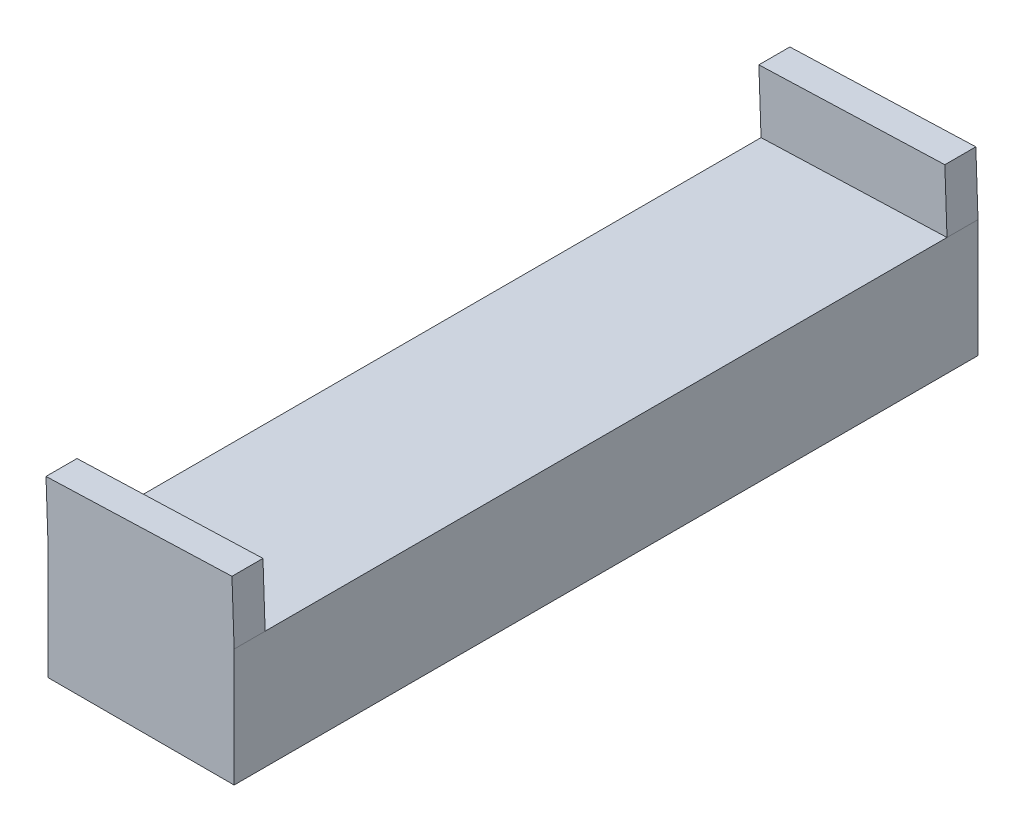
ISO-10303-21;
HEADER;
FILE_DESCRIPTION(('STEP AP214'),'2;1');
FILE_NAME('part.step','',(''),(''),'','','');
FILE_SCHEMA(('AUTOMOTIVE_DESIGN { 1 0 10303 214 1 1 1 1 }'));
ENDSEC;
DATA;
#1=APPLICATION_CONTEXT('core data for automotive mechanical design processes');
#2=APPLICATION_PROTOCOL_DEFINITION('international standard','automotive_design',2000,#1);
#3=PRODUCT_CONTEXT('',#1,'mechanical');
#4=PRODUCT('Part','Part','',(#3));
#5=PRODUCT_RELATED_PRODUCT_CATEGORY('part','',(#4));
#6=PRODUCT_DEFINITION_FORMATION('','',#4);
#7=PRODUCT_DEFINITION_CONTEXT('part definition',#1,'design');
#8=PRODUCT_DEFINITION('design','',#6,#7);
#9=PRODUCT_DEFINITION_SHAPE('','',#8);
#10=(LENGTH_UNIT() NAMED_UNIT(*) SI_UNIT(.MILLI.,.METRE.));
#11=(NAMED_UNIT(*) PLANE_ANGLE_UNIT() SI_UNIT($,.RADIAN.));
#12=(NAMED_UNIT(*) SI_UNIT($,.STERADIAN.) SOLID_ANGLE_UNIT());
#13=UNCERTAINTY_MEASURE_WITH_UNIT(LENGTH_MEASURE(1.E-05),#10,'distance_accuracy_value','');
#14=(GEOMETRIC_REPRESENTATION_CONTEXT(3) GLOBAL_UNCERTAINTY_ASSIGNED_CONTEXT((#13)) GLOBAL_UNIT_ASSIGNED_CONTEXT((#10,
#11,#12)) REPRESENTATION_CONTEXT('',''));
#15=CARTESIAN_POINT('',(0.,0.,0.));
#16=DIRECTION('',(0.,0.,1.));
#17=DIRECTION('',(1.,0.,0.));
#18=AXIS2_PLACEMENT_3D('',#15,#16,#17);
#19=CARTESIAN_POINT('',(738.734501426572,19.,-6544.76084793364));
#20=DIRECTION('',(0.034899496702494,-0.999390827019096,0.));
#21=DIRECTION('',(0.999390827019096,0.034899496702494,0.));
#22=AXIS2_PLACEMENT_3D('',#19,#20,#21);
#23=PLANE('',#22);
#24=DIRECTION('',(-0.999390827019096,-0.034899496702494,0.));
#25=VECTOR('',#24,1.);
#26=CARTESIAN_POINT('',(738.734501426572,19.,-6429.76084793364));
#27=LINE('',#26,#25);
#28=CARTESIAN_POINT('',(738.734501426572,19.,-6429.76084793364));
#29=VERTEX_POINT('',#28);
#30=CARTESIAN_POINT('',(708.734501426572,17.9523769152478,-6429.76084793364));
#31=VERTEX_POINT('',#30);
#32=EDGE_CURVE('E212',#29,#31,#27,.T.);
#33=ORIENTED_EDGE('',*,*,#32,.F.);
#34=DIRECTION('',(0.,0.,-1.));
#35=VECTOR('',#34,1.);
#36=CARTESIAN_POINT('',(738.734501426572,19.,-6544.76084793364));
#37=LINE('',#36,#35);
#38=CARTESIAN_POINT('',(738.734501426572,19.,-6539.76084793364));
#39=VERTEX_POINT('',#38);
#40=EDGE_CURVE('E171',#29,#39,#37,.T.);
#41=ORIENTED_EDGE('',*,*,#40,.T.);
#42=DIRECTION('',(0.999390827019096,0.034899496702494,0.));
#43=VECTOR('',#42,1.);
#44=CARTESIAN_POINT('',(708.734501426572,17.9523769152478,-6539.76084793364));
#45=LINE('',#44,#43);
#46=CARTESIAN_POINT('',(708.734501426572,17.9523769152478,-6539.76084793364));
#47=VERTEX_POINT('',#46);
#48=EDGE_CURVE('E55',#47,#39,#45,.T.);
#49=ORIENTED_EDGE('',*,*,#48,.F.);
#50=DIRECTION('',(0.,0.,1.));
#51=VECTOR('',#50,1.);
#52=CARTESIAN_POINT('',(708.734501426572,17.9523769152478,-6544.76084793364));
#53=LINE('',#52,#51);
#54=EDGE_CURVE('E164',#47,#31,#53,.T.);
#55=ORIENTED_EDGE('',*,*,#54,.T.);
#56=EDGE_LOOP('',(#33,#41,#49,#55));
#57=FACE_BOUND('',#56,.T.);
#58=ADVANCED_FACE('F33',(#57),#23,.F.);
#59=CARTESIAN_POINT('',(708.734501426572,19.,-6544.76084793364));
#60=DIRECTION('',(1.,0.,0.));
#61=DIRECTION('',(0.,0.,-1.));
#62=AXIS2_PLACEMENT_3D('',#59,#60,#61);
#63=PLANE('',#62);
#64=DIRECTION('',(0.,-1.,0.));
#65=VECTOR('',#64,1.);
#66=CARTESIAN_POINT('',(708.734501426572,19.,-6424.76084793364));
#67=LINE('',#66,#65);
#68=CARTESIAN_POINT('',(708.734501426572,17.9523769152478,-6424.76084793364));
#69=VERTEX_POINT('',#68);
#70=CARTESIAN_POINT('',(708.734501426572,0.,-6424.76084793364));
#71=VERTEX_POINT('',#70);
#72=EDGE_CURVE('E11',#69,#71,#67,.T.);
#73=ORIENTED_EDGE('',*,*,#72,.F.);
#74=DIRECTION('',(0.,0.,1.));
#75=VECTOR('',#74,1.);
#76=CARTESIAN_POINT('',(708.734501426572,17.9523769152478,-6424.76084793364));
#77=LINE('',#76,#75);
#78=EDGE_CURVE('E48',#31,#69,#77,.T.);
#79=ORIENTED_EDGE('',*,*,#78,.F.);
#80=ORIENTED_EDGE('',*,*,#54,.F.);
#81=CARTESIAN_POINT('',(708.734501426572,17.9523769152478,-6544.76084793364));
#82=VERTEX_POINT('',#81);
#83=EDGE_CURVE('E165',#82,#47,#53,.T.);
#84=ORIENTED_EDGE('',*,*,#83,.F.);
#85=DIRECTION('',(0.,-1.,0.));
#86=VECTOR('',#85,1.);
#87=CARTESIAN_POINT('',(708.734501426572,19.,-6544.76084793364));
#88=LINE('',#87,#86);
#89=CARTESIAN_POINT('',(708.734501426572,0.,-6544.76084793364));
#90=VERTEX_POINT('',#89);
#91=EDGE_CURVE('E170',#82,#90,#88,.T.);
#92=ORIENTED_EDGE('',*,*,#91,.T.);
#93=DIRECTION('',(0.,0.,1.));
#94=VECTOR('',#93,1.);
#95=CARTESIAN_POINT('',(708.734501426572,0.,-6544.76084793364));
#96=LINE('',#95,#94);
#97=EDGE_CURVE('E168',#90,#71,#96,.T.);
#98=ORIENTED_EDGE('',*,*,#97,.T.);
#99=EDGE_LOOP('',(#73,#79,#80,#84,#92,#98));
#100=FACE_BOUND('',#99,.T.);
#101=ADVANCED_FACE('F35',(#100),#63,.F.);
#102=CARTESIAN_POINT('',(708.734501426572,19.,-6424.76084793364));
#103=DIRECTION('',(0.,0.,-1.));
#104=DIRECTION('',(-1.,0.,0.));
#105=AXIS2_PLACEMENT_3D('',#102,#103,#104);
#106=PLANE('',#105);
#107=DIRECTION('',(0.,-1.,0.));
#108=VECTOR('',#107,1.);
#109=CARTESIAN_POINT('',(738.734501426572,19.,-6424.76084793364));
#110=LINE('',#109,#108);
#111=CARTESIAN_POINT('',(738.734501426572,19.,-6424.76084793364));
#112=VERTEX_POINT('',#111);
#113=CARTESIAN_POINT('',(738.734501426572,0.,-6424.76084793364));
#114=VERTEX_POINT('',#113);
#115=EDGE_CURVE('E41',#112,#114,#110,.T.);
#116=ORIENTED_EDGE('',*,*,#115,.F.);
#117=DIRECTION('',(0.034899496702494,-0.999390827019096,0.));
#118=VECTOR('',#117,1.);
#119=CARTESIAN_POINT('',(738.385506459547,28.993908270191,-6424.76084793364));
#120=LINE('',#119,#118);
#121=CARTESIAN_POINT('',(738.385506459547,28.993908270191,-6424.76084793364));
#122=VERTEX_POINT('',#121);
#123=EDGE_CURVE('E219',#122,#112,#120,.T.);
#124=ORIENTED_EDGE('',*,*,#123,.F.);
#125=DIRECTION('',(0.999390827019096,0.034899496702494,0.));
#126=VECTOR('',#125,1.);
#127=CARTESIAN_POINT('',(738.385506459547,28.993908270191,-6424.76084793364));
#128=LINE('',#127,#126);
#129=CARTESIAN_POINT('',(708.385506459547,27.9462851854387,-6424.76084793364));
#130=VERTEX_POINT('',#129);
#131=EDGE_CURVE('E126',#130,#122,#128,.T.);
#132=ORIENTED_EDGE('',*,*,#131,.F.);
#133=DIRECTION('',(0.034899496702494,-0.999390827019096,0.));
#134=VECTOR('',#133,1.);
#135=CARTESIAN_POINT('',(708.385506459547,27.9462851854387,-6424.76084793364));
#136=LINE('',#135,#134);
#137=EDGE_CURVE('E137',#130,#69,#136,.T.);
#138=ORIENTED_EDGE('',*,*,#137,.T.);
#139=ORIENTED_EDGE('',*,*,#72,.T.);
#140=DIRECTION('',(1.,0.,0.));
#141=VECTOR('',#140,1.);
#142=CARTESIAN_POINT('',(708.734501426572,0.,-6424.76084793364));
#143=LINE('',#142,#141);
#144=EDGE_CURVE('E174',#71,#114,#143,.T.);
#145=ORIENTED_EDGE('',*,*,#144,.T.);
#146=EDGE_LOOP('',(#116,#124,#132,#138,#139,#145));
#147=FACE_BOUND('',#146,.T.);
#148=ADVANCED_FACE('F223',(#147),#106,.F.);
#149=CARTESIAN_POINT('',(738.734501426572,19.,-6544.76084793364));
#150=DIRECTION('',(-1.,0.,0.));
#151=DIRECTION('',(0.,0.,1.));
#152=AXIS2_PLACEMENT_3D('',#149,#150,#151);
#153=PLANE('',#152);
#154=DIRECTION('',(0.,0.,-1.));
#155=VECTOR('',#154,1.);
#156=CARTESIAN_POINT('',(738.734501426572,0.,-6544.76084793364));
#157=LINE('',#156,#155);
#158=CARTESIAN_POINT('',(738.734501426572,0.,-6544.76084793364));
#159=VERTEX_POINT('',#158);
#160=EDGE_CURVE('E176',#114,#159,#157,.T.);
#161=ORIENTED_EDGE('',*,*,#160,.T.);
#162=DIRECTION('',(0.,-1.,0.));
#163=VECTOR('',#162,1.);
#164=CARTESIAN_POINT('',(738.734501426572,19.,-6544.76084793364));
#165=LINE('',#164,#163);
#166=CARTESIAN_POINT('',(738.734501426572,19.,-6544.76084793364));
#167=VERTEX_POINT('',#166);
#168=EDGE_CURVE('E182',#167,#159,#165,.T.);
#169=ORIENTED_EDGE('',*,*,#168,.F.);
#170=DIRECTION('',(0.,0.,-1.));
#171=VECTOR('',#170,1.);
#172=CARTESIAN_POINT('',(738.734501426572,19.,-6539.76084793364));
#173=LINE('',#172,#171);
#174=EDGE_CURVE('E135',#39,#167,#173,.T.);
#175=ORIENTED_EDGE('',*,*,#174,.F.);
#176=ORIENTED_EDGE('',*,*,#40,.F.);
#177=EDGE_CURVE('E133',#112,#29,#37,.T.);
#178=ORIENTED_EDGE('',*,*,#177,.F.);
#179=ORIENTED_EDGE('',*,*,#115,.T.);
#180=EDGE_LOOP('',(#161,#169,#175,#176,#178,#179));
#181=FACE_BOUND('',#180,.T.);
#182=ADVANCED_FACE('F187',(#181),#153,.F.);
#183=CARTESIAN_POINT('',(708.734501426572,19.,-6544.76084793364));
#184=DIRECTION('',(0.,0.,1.));
#185=DIRECTION('',(1.,0.,0.));
#186=AXIS2_PLACEMENT_3D('',#183,#184,#185);
#187=PLANE('',#186);
#188=ORIENTED_EDGE('',*,*,#91,.F.);
#189=DIRECTION('',(0.034899496702494,-0.999390827019096,0.));
#190=VECTOR('',#189,1.);
#191=CARTESIAN_POINT('',(708.385506459547,27.9462851854387,-6544.76084793364));
#192=LINE('',#191,#190);
#193=CARTESIAN_POINT('',(708.385506459547,27.9462851854387,-6544.76084793364));
#194=VERTEX_POINT('',#193);
#195=EDGE_CURVE('E149',#194,#82,#192,.T.);
#196=ORIENTED_EDGE('',*,*,#195,.F.);
#197=DIRECTION('',(-0.999390827019096,-0.034899496702494,0.));
#198=VECTOR('',#197,1.);
#199=CARTESIAN_POINT('',(708.385506459547,27.9462851854387,-6544.76084793364));
#200=LINE('',#199,#198);
#201=CARTESIAN_POINT('',(738.385506459547,28.993908270191,-6544.76084793364));
#202=VERTEX_POINT('',#201);
#203=EDGE_CURVE('E148',#202,#194,#200,.T.);
#204=ORIENTED_EDGE('',*,*,#203,.F.);
#205=DIRECTION('',(0.034899496702494,-0.999390827019096,0.));
#206=VECTOR('',#205,1.);
#207=CARTESIAN_POINT('',(738.385506459547,28.993908270191,-6544.76084793364));
#208=LINE('',#207,#206);
#209=EDGE_CURVE('E155',#202,#167,#208,.T.);
#210=ORIENTED_EDGE('',*,*,#209,.T.);
#211=ORIENTED_EDGE('',*,*,#168,.T.);
#212=DIRECTION('',(-1.,0.,0.));
#213=VECTOR('',#212,1.);
#214=CARTESIAN_POINT('',(708.734501426572,0.,-6544.76084793364));
#215=LINE('',#214,#213);
#216=EDGE_CURVE('E178',#159,#90,#215,.T.);
#217=ORIENTED_EDGE('',*,*,#216,.T.);
#218=EDGE_LOOP('',(#188,#196,#204,#210,#211,#217));
#219=FACE_BOUND('',#218,.T.);
#220=ADVANCED_FACE('F196',(#219),#187,.F.);
#221=CARTESIAN_POINT('',(0.,0.,0.));
#222=DIRECTION('',(0.,1.,0.));
#223=DIRECTION('',(0.,0.,1.));
#224=AXIS2_PLACEMENT_3D('',#221,#222,#223);
#225=PLANE('',#224);
#226=ORIENTED_EDGE('',*,*,#97,.F.);
#227=ORIENTED_EDGE('',*,*,#216,.F.);
#228=ORIENTED_EDGE('',*,*,#160,.F.);
#229=ORIENTED_EDGE('',*,*,#144,.F.);
#230=EDGE_LOOP('',(#226,#227,#228,#229));
#231=FACE_BOUND('',#230,.T.);
#232=ADVANCED_FACE('F193',(#231),#225,.F.);
#233=CARTESIAN_POINT('',(708.385506459547,27.9462851854387,-6539.76084793364));
#234=DIRECTION('',(0.999390827019096,0.034899496702494,0.));
#235=DIRECTION('',(-0.034899496702494,0.999390827019096,0.));
#236=AXIS2_PLACEMENT_3D('',#233,#234,#235);
#237=PLANE('',#236);
#238=ORIENTED_EDGE('',*,*,#83,.T.);
#239=DIRECTION('',(0.034899496702494,-0.999390827019096,0.));
#240=VECTOR('',#239,1.);
#241=CARTESIAN_POINT('',(708.385506459547,27.9462851854387,-6539.76084793364));
#242=LINE('',#241,#240);
#243=CARTESIAN_POINT('',(708.385506459547,27.9462851854387,-6539.76084793364));
#244=VERTEX_POINT('',#243);
#245=EDGE_CURVE('E161',#244,#47,#242,.T.);
#246=ORIENTED_EDGE('',*,*,#245,.F.);
#247=DIRECTION('',(0.,0.,1.));
#248=VECTOR('',#247,1.);
#249=CARTESIAN_POINT('',(708.385506459547,27.9462851854387,-6539.76084793364));
#250=LINE('',#249,#248);
#251=EDGE_CURVE('E141',#194,#244,#250,.T.);
#252=ORIENTED_EDGE('',*,*,#251,.F.);
#253=ORIENTED_EDGE('',*,*,#195,.T.);
#254=EDGE_LOOP('',(#238,#246,#252,#253));
#255=FACE_BOUND('',#254,.T.);
#256=ADVANCED_FACE('F210',(#255),#237,.F.);
#257=CARTESIAN_POINT('',(708.385506459547,27.9462851854387,-6539.76084793364));
#258=DIRECTION('',(0.,0.,-1.));
#259=DIRECTION('',(-1.,0.,0.));
#260=AXIS2_PLACEMENT_3D('',#257,#258,#259);
#261=PLANE('',#260);
#262=ORIENTED_EDGE('',*,*,#48,.T.);
#263=DIRECTION('',(0.034899496702494,-0.999390827019096,0.));
#264=VECTOR('',#263,1.);
#265=CARTESIAN_POINT('',(738.385506459547,28.993908270191,-6539.76084793364));
#266=LINE('',#265,#264);
#267=CARTESIAN_POINT('',(738.385506459547,28.993908270191,-6539.76084793364));
#268=VERTEX_POINT('',#267);
#269=EDGE_CURVE('E158',#268,#39,#266,.T.);
#270=ORIENTED_EDGE('',*,*,#269,.F.);
#271=DIRECTION('',(0.999390827019096,0.034899496702494,0.));
#272=VECTOR('',#271,1.);
#273=CARTESIAN_POINT('',(708.385506459547,27.9462851854387,-6539.76084793364));
#274=LINE('',#273,#272);
#275=EDGE_CURVE('E144',#244,#268,#274,.T.);
#276=ORIENTED_EDGE('',*,*,#275,.F.);
#277=ORIENTED_EDGE('',*,*,#245,.T.);
#278=EDGE_LOOP('',(#262,#270,#276,#277));
#279=FACE_BOUND('',#278,.T.);
#280=ADVANCED_FACE('F206',(#279),#261,.F.);
#281=CARTESIAN_POINT('',(738.385506459547,28.993908270191,-6539.76084793364));
#282=DIRECTION('',(-0.999390827019096,-0.034899496702494,0.));
#283=DIRECTION('',(0.034899496702494,-0.999390827019096,0.));
#284=AXIS2_PLACEMENT_3D('',#281,#282,#283);
#285=PLANE('',#284);
#286=ORIENTED_EDGE('',*,*,#174,.T.);
#287=ORIENTED_EDGE('',*,*,#209,.F.);
#288=DIRECTION('',(0.,0.,-1.));
#289=VECTOR('',#288,1.);
#290=CARTESIAN_POINT('',(738.385506459547,28.993908270191,-6539.76084793364));
#291=LINE('',#290,#289);
#292=EDGE_CURVE('E146',#268,#202,#291,.T.);
#293=ORIENTED_EDGE('',*,*,#292,.F.);
#294=ORIENTED_EDGE('',*,*,#269,.T.);
#295=EDGE_LOOP('',(#286,#287,#293,#294));
#296=FACE_BOUND('',#295,.T.);
#297=ADVANCED_FACE('F202',(#296),#285,.F.);
#298=CARTESIAN_POINT('',(-0.111921409189897,3.20500982134336,0.));
#299=DIRECTION('',(0.034899496702494,-0.999390827019096,0.));
#300=DIRECTION('',(0.999390827019096,0.034899496702494,0.));
#301=AXIS2_PLACEMENT_3D('',#298,#299,#300);
#302=PLANE('',#301);
#303=ORIENTED_EDGE('',*,*,#251,.T.);
#304=ORIENTED_EDGE('',*,*,#275,.T.);
#305=ORIENTED_EDGE('',*,*,#292,.T.);
#306=ORIENTED_EDGE('',*,*,#203,.T.);
#307=EDGE_LOOP('',(#303,#304,#305,#306));
#308=FACE_BOUND('',#307,.T.);
#309=ADVANCED_FACE('F264',(#308),#302,.F.);
#310=CARTESIAN_POINT('',(738.385506459547,28.993908270191,-6424.76084793364));
#311=DIRECTION('',(-0.999390827019096,-0.034899496702494,0.));
#312=DIRECTION('',(0.034899496702494,-0.999390827019096,0.));
#313=AXIS2_PLACEMENT_3D('',#310,#311,#312);
#314=PLANE('',#313);
#315=ORIENTED_EDGE('',*,*,#177,.T.);
#316=DIRECTION('',(0.034899496702494,-0.999390827019096,0.));
#317=VECTOR('',#316,1.);
#318=CARTESIAN_POINT('',(738.385506459547,28.993908270191,-6429.76084793364));
#319=LINE('',#318,#317);
#320=CARTESIAN_POINT('',(738.385506459547,28.993908270191,-6429.76084793364));
#321=VERTEX_POINT('',#320);
#322=EDGE_CURVE('E114',#321,#29,#319,.T.);
#323=ORIENTED_EDGE('',*,*,#322,.F.);
#324=DIRECTION('',(0.,0.,-1.));
#325=VECTOR('',#324,1.);
#326=CARTESIAN_POINT('',(738.385506459547,28.993908270191,-6424.76084793364));
#327=LINE('',#326,#325);
#328=EDGE_CURVE('E121',#122,#321,#327,.T.);
#329=ORIENTED_EDGE('',*,*,#328,.F.);
#330=ORIENTED_EDGE('',*,*,#123,.T.);
#331=EDGE_LOOP('',(#315,#323,#329,#330));
#332=FACE_BOUND('',#331,.T.);
#333=ADVANCED_FACE('F131',(#332),#314,.F.);
#334=CARTESIAN_POINT('',(738.385506459547,28.993908270191,-6429.76084793364));
#335=DIRECTION('',(0.,0.,1.));
#336=DIRECTION('',(1.,0.,0.));
#337=AXIS2_PLACEMENT_3D('',#334,#335,#336);
#338=PLANE('',#337);
#339=ORIENTED_EDGE('',*,*,#32,.T.);
#340=DIRECTION('',(0.034899496702494,-0.999390827019096,0.));
#341=VECTOR('',#340,1.);
#342=CARTESIAN_POINT('',(708.385506459547,27.9462851854387,-6429.76084793364));
#343=LINE('',#342,#341);
#344=CARTESIAN_POINT('',(708.385506459547,27.9462851854387,-6429.76084793364));
#345=VERTEX_POINT('',#344);
#346=EDGE_CURVE('E117',#345,#31,#343,.T.);
#347=ORIENTED_EDGE('',*,*,#346,.F.);
#348=DIRECTION('',(-0.999390827019096,-0.034899496702494,0.));
#349=VECTOR('',#348,1.);
#350=CARTESIAN_POINT('',(738.385506459547,28.993908270191,-6429.76084793364));
#351=LINE('',#350,#349);
#352=EDGE_CURVE('E109',#321,#345,#351,.T.);
#353=ORIENTED_EDGE('',*,*,#352,.F.);
#354=ORIENTED_EDGE('',*,*,#322,.T.);
#355=EDGE_LOOP('',(#339,#347,#353,#354));
#356=FACE_BOUND('',#355,.T.);
#357=ADVANCED_FACE('F112',(#356),#338,.F.);
#358=CARTESIAN_POINT('',(708.385506459547,27.9462851854387,-6424.76084793364));
#359=DIRECTION('',(0.999390827019096,0.034899496702494,0.));
#360=DIRECTION('',(-0.034899496702494,0.999390827019096,0.));
#361=AXIS2_PLACEMENT_3D('',#358,#359,#360);
#362=PLANE('',#361);
#363=ORIENTED_EDGE('',*,*,#78,.T.);
#364=ORIENTED_EDGE('',*,*,#137,.F.);
#365=DIRECTION('',(0.,0.,1.));
#366=VECTOR('',#365,1.);
#367=CARTESIAN_POINT('',(708.385506459547,27.9462851854387,-6424.76084793364));
#368=LINE('',#367,#366);
#369=EDGE_CURVE('E120',#345,#130,#368,.T.);
#370=ORIENTED_EDGE('',*,*,#369,.F.);
#371=ORIENTED_EDGE('',*,*,#346,.T.);
#372=EDGE_LOOP('',(#363,#364,#370,#371));
#373=FACE_BOUND('',#372,.T.);
#374=ADVANCED_FACE('F215',(#373),#362,.F.);
#375=CARTESIAN_POINT('',(-0.111921409189897,3.20500982134337,0.));
#376=DIRECTION('',(-0.034899496702494,0.999390827019096,0.));
#377=DIRECTION('',(-0.999390827019096,-0.034899496702494,0.));
#378=AXIS2_PLACEMENT_3D('',#375,#376,#377);
#379=PLANE('',#378);
#380=ORIENTED_EDGE('',*,*,#328,.T.);
#381=ORIENTED_EDGE('',*,*,#352,.T.);
#382=ORIENTED_EDGE('',*,*,#369,.T.);
#383=ORIENTED_EDGE('',*,*,#131,.T.);
#384=EDGE_LOOP('',(#380,#381,#382,#383));
#385=FACE_BOUND('',#384,.T.);
#386=ADVANCED_FACE('F124',(#385),#379,.T.);
#387=CLOSED_SHELL('',(#58,#101,#148,#182,#220,#232,#256,#280,#297,#309,#333,#357,#374,#386));
#388=MANIFOLD_SOLID_BREP('B2',#387);
#389=ADVANCED_BREP_SHAPE_REPRESENTATION('',(#18,#388),#14);
#390=SHAPE_DEFINITION_REPRESENTATION(#9,#389);
ENDSEC;
END-ISO-10303-21;
